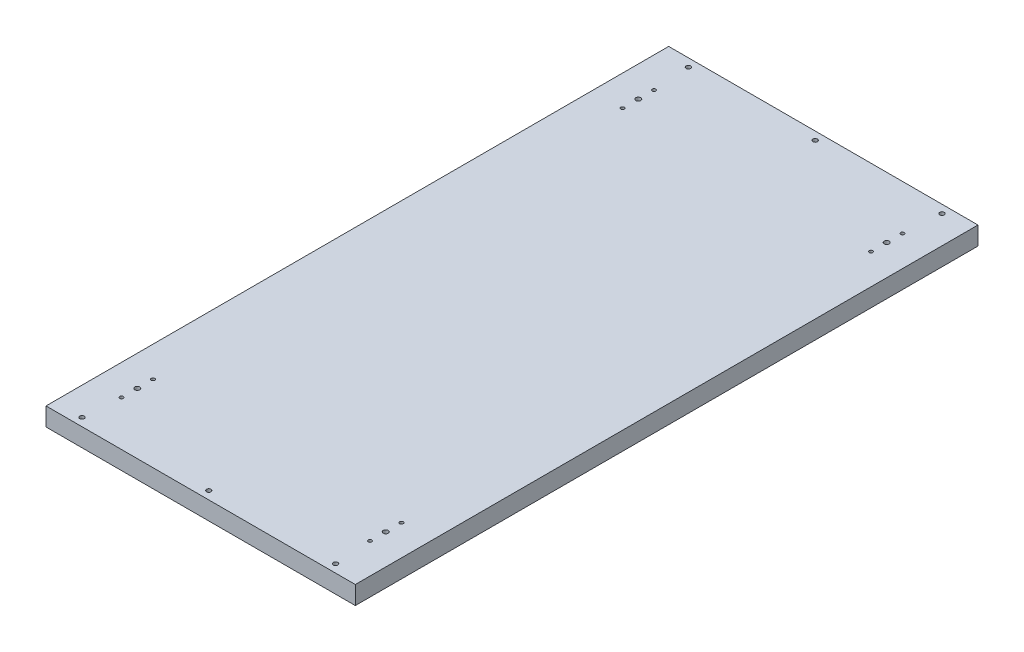
ISO-10303-21;
HEADER;
FILE_DESCRIPTION(('STEP AP214'),'2;1');
FILE_NAME('part.step','',(''),(''),'','','');
FILE_SCHEMA(('AUTOMOTIVE_DESIGN { 1 0 10303 214 1 1 1 1 }'));
ENDSEC;
DATA;
#1=APPLICATION_CONTEXT('core data for automotive mechanical design processes');
#2=APPLICATION_PROTOCOL_DEFINITION('international standard','automotive_design',2000,#1);
#3=PRODUCT_CONTEXT('',#1,'mechanical');
#4=PRODUCT('Part','Part','',(#3));
#5=PRODUCT_RELATED_PRODUCT_CATEGORY('part','',(#4));
#6=PRODUCT_DEFINITION_FORMATION('','',#4);
#7=PRODUCT_DEFINITION_CONTEXT('part definition',#1,'design');
#8=PRODUCT_DEFINITION('design','',#6,#7);
#9=PRODUCT_DEFINITION_SHAPE('','',#8);
#10=(LENGTH_UNIT() NAMED_UNIT(*) SI_UNIT(.MILLI.,.METRE.));
#11=(NAMED_UNIT(*) PLANE_ANGLE_UNIT() SI_UNIT($,.RADIAN.));
#12=(NAMED_UNIT(*) SI_UNIT($,.STERADIAN.) SOLID_ANGLE_UNIT());
#13=UNCERTAINTY_MEASURE_WITH_UNIT(LENGTH_MEASURE(1.E-05),#10,'distance_accuracy_value','');
#14=(GEOMETRIC_REPRESENTATION_CONTEXT(3) GLOBAL_UNCERTAINTY_ASSIGNED_CONTEXT((#13)) GLOBAL_UNIT_ASSIGNED_CONTEXT((#10,
#11,#12)) REPRESENTATION_CONTEXT('',''));
#15=CARTESIAN_POINT('',(0.,0.,0.));
#16=DIRECTION('',(0.,0.,1.));
#17=DIRECTION('',(1.,0.,0.));
#18=AXIS2_PLACEMENT_3D('',#15,#16,#17);
#19=CARTESIAN_POINT('',(-152.5,9.,-307.));
#20=DIRECTION('',(0.,0.,-1.));
#21=DIRECTION('',(-1.,0.,0.));
#22=AXIS2_PLACEMENT_3D('',#19,#20,#21);
#23=PLANE('',#22);
#24=DIRECTION('',(1.,0.,0.));
#25=VECTOR('',#24,1.);
#26=CARTESIAN_POINT('',(-152.5,-9.,-307.));
#27=LINE('',#26,#25);
#28=CARTESIAN_POINT('',(-152.5,-9.,-307.));
#29=VERTEX_POINT('',#28);
#30=CARTESIAN_POINT('',(152.5,-9.,-307.));
#31=VERTEX_POINT('',#30);
#32=EDGE_CURVE('E111',#29,#31,#27,.T.);
#33=ORIENTED_EDGE('',*,*,#32,.F.);
#34=DIRECTION('',(0.,-1.,0.));
#35=VECTOR('',#34,1.);
#36=CARTESIAN_POINT('',(-152.5,9.,-307.));
#37=LINE('',#36,#35);
#38=CARTESIAN_POINT('',(-152.5,9.,-307.));
#39=VERTEX_POINT('',#38);
#40=EDGE_CURVE('E11',#39,#29,#37,.T.);
#41=ORIENTED_EDGE('',*,*,#40,.F.);
#42=DIRECTION('',(1.,0.,0.));
#43=VECTOR('',#42,1.);
#44=CARTESIAN_POINT('',(-152.5,9.,-307.));
#45=LINE('',#44,#43);
#46=CARTESIAN_POINT('',(152.5,9.,-307.));
#47=VERTEX_POINT('',#46);
#48=EDGE_CURVE('E105',#39,#47,#45,.T.);
#49=ORIENTED_EDGE('',*,*,#48,.T.);
#50=DIRECTION('',(0.,-1.,0.));
#51=VECTOR('',#50,1.);
#52=CARTESIAN_POINT('',(152.5,9.,-307.));
#53=LINE('',#52,#51);
#54=EDGE_CURVE('E48',#47,#31,#53,.T.);
#55=ORIENTED_EDGE('',*,*,#54,.T.);
#56=EDGE_LOOP('',(#33,#41,#49,#55));
#57=FACE_BOUND('',#56,.T.);
#58=ADVANCED_FACE('F45',(#57),#23,.T.);
#59=CARTESIAN_POINT('',(-152.5,9.,-307.));
#60=DIRECTION('',(1.,0.,0.));
#61=DIRECTION('',(0.,0.,-1.));
#62=AXIS2_PLACEMENT_3D('',#59,#60,#61);
#63=PLANE('',#62);
#64=DIRECTION('',(0.,0.,1.));
#65=VECTOR('',#64,1.);
#66=CARTESIAN_POINT('',(-152.5,-9.,-307.));
#67=LINE('',#66,#65);
#68=CARTESIAN_POINT('',(-152.5,-9.,307.));
#69=VERTEX_POINT('',#68);
#70=EDGE_CURVE('E78',#29,#69,#67,.T.);
#71=ORIENTED_EDGE('',*,*,#70,.T.);
#72=DIRECTION('',(0.,-1.,0.));
#73=VECTOR('',#72,1.);
#74=CARTESIAN_POINT('',(-152.5,9.,307.));
#75=LINE('',#74,#73);
#76=CARTESIAN_POINT('',(-152.5,9.,307.));
#77=VERTEX_POINT('',#76);
#78=EDGE_CURVE('E54',#77,#69,#75,.T.);
#79=ORIENTED_EDGE('',*,*,#78,.F.);
#80=DIRECTION('',(0.,0.,1.));
#81=VECTOR('',#80,1.);
#82=CARTESIAN_POINT('',(-152.5,9.,-307.));
#83=LINE('',#82,#81);
#84=EDGE_CURVE('E95',#39,#77,#83,.T.);
#85=ORIENTED_EDGE('',*,*,#84,.F.);
#86=ORIENTED_EDGE('',*,*,#40,.T.);
#87=EDGE_LOOP('',(#71,#79,#85,#86));
#88=FACE_BOUND('',#87,.T.);
#89=ADVANCED_FACE('F122',(#88),#63,.F.);
#90=CARTESIAN_POINT('',(-152.5,9.,307.));
#91=DIRECTION('',(0.,0.,-1.));
#92=DIRECTION('',(-1.,0.,0.));
#93=AXIS2_PLACEMENT_3D('',#90,#91,#92);
#94=PLANE('',#93);
#95=DIRECTION('',(1.,0.,0.));
#96=VECTOR('',#95,1.);
#97=CARTESIAN_POINT('',(-152.5,-9.,307.));
#98=LINE('',#97,#96);
#99=CARTESIAN_POINT('',(152.5,-9.,307.));
#100=VERTEX_POINT('',#99);
#101=EDGE_CURVE('E102',#69,#100,#98,.T.);
#102=ORIENTED_EDGE('',*,*,#101,.T.);
#103=DIRECTION('',(0.,-1.,0.));
#104=VECTOR('',#103,1.);
#105=CARTESIAN_POINT('',(152.5,9.,307.));
#106=LINE('',#105,#104);
#107=CARTESIAN_POINT('',(152.5,9.,307.));
#108=VERTEX_POINT('',#107);
#109=EDGE_CURVE('E99',#108,#100,#106,.T.);
#110=ORIENTED_EDGE('',*,*,#109,.F.);
#111=DIRECTION('',(1.,0.,0.));
#112=VECTOR('',#111,1.);
#113=CARTESIAN_POINT('',(-152.5,9.,307.));
#114=LINE('',#113,#112);
#115=EDGE_CURVE('E90',#77,#108,#114,.T.);
#116=ORIENTED_EDGE('',*,*,#115,.F.);
#117=ORIENTED_EDGE('',*,*,#78,.T.);
#118=EDGE_LOOP('',(#102,#110,#116,#117));
#119=FACE_BOUND('',#118,.T.);
#120=ADVANCED_FACE('F100',(#119),#94,.F.);
#121=CARTESIAN_POINT('',(152.5,9.,-307.));
#122=DIRECTION('',(1.,0.,0.));
#123=DIRECTION('',(0.,0.,-1.));
#124=AXIS2_PLACEMENT_3D('',#121,#122,#123);
#125=PLANE('',#124);
#126=DIRECTION('',(0.,0.,1.));
#127=VECTOR('',#126,1.);
#128=CARTESIAN_POINT('',(152.5,-9.,-307.));
#129=LINE('',#128,#127);
#130=EDGE_CURVE('E114',#31,#100,#129,.T.);
#131=ORIENTED_EDGE('',*,*,#130,.F.);
#132=ORIENTED_EDGE('',*,*,#54,.F.);
#133=DIRECTION('',(0.,0.,1.));
#134=VECTOR('',#133,1.);
#135=CARTESIAN_POINT('',(152.5,9.,-307.));
#136=LINE('',#135,#134);
#137=EDGE_CURVE('E94',#47,#108,#136,.T.);
#138=ORIENTED_EDGE('',*,*,#137,.T.);
#139=ORIENTED_EDGE('',*,*,#109,.T.);
#140=EDGE_LOOP('',(#131,#132,#138,#139));
#141=FACE_BOUND('',#140,.T.);
#142=ADVANCED_FACE('F104',(#141),#125,.T.);
#143=CARTESIAN_POINT('',(0.,9.,0.));
#144=DIRECTION('',(0.,-1.,0.));
#145=DIRECTION('',(0.,0.,-1.));
#146=AXIS2_PLACEMENT_3D('',#143,#144,#145);
#147=PLANE('',#146);
#148=CARTESIAN_POINT('',(122.5,9.,-247.));
#149=DIRECTION('',(0.,-1.,0.));
#150=DIRECTION('',(0.,0.,-1.));
#151=AXIS2_PLACEMENT_3D('',#148,#149,#150);
#152=CIRCLE('',#151,2.45745);
#153=CARTESIAN_POINT('',(122.5,9.,-249.45745));
#154=VERTEX_POINT('',#153);
#155=EDGE_CURVE('E244',#154,#154,#152,.T.);
#156=ORIENTED_EDGE('',*,*,#155,.T.);
#157=EDGE_LOOP('',(#156));
#158=FACE_BOUND('',#157,.T.);
#159=CARTESIAN_POINT('',(-122.5,9.,-247.));
#160=DIRECTION('',(0.,-1.,0.));
#161=DIRECTION('',(0.,0.,-1.));
#162=AXIS2_PLACEMENT_3D('',#159,#160,#161);
#163=CIRCLE('',#162,2.45745);
#164=CARTESIAN_POINT('',(-122.5,9.,-249.45745));
#165=VERTEX_POINT('',#164);
#166=EDGE_CURVE('E254',#165,#165,#163,.T.);
#167=ORIENTED_EDGE('',*,*,#166,.T.);
#168=EDGE_LOOP('',(#167));
#169=FACE_BOUND('',#168,.T.);
#170=CARTESIAN_POINT('',(122.5,9.,247.));
#171=DIRECTION('',(0.,-1.,0.));
#172=DIRECTION('',(0.,0.,-1.));
#173=AXIS2_PLACEMENT_3D('',#170,#171,#172);
#174=CIRCLE('',#173,2.45745);
#175=CARTESIAN_POINT('',(122.5,9.,244.54255));
#176=VERTEX_POINT('',#175);
#177=EDGE_CURVE('E260',#176,#176,#174,.T.);
#178=ORIENTED_EDGE('',*,*,#177,.T.);
#179=EDGE_LOOP('',(#178));
#180=FACE_BOUND('',#179,.T.);
#181=CARTESIAN_POINT('',(122.5,9.,-262.5));
#182=DIRECTION('',(0.,-1.,0.));
#183=DIRECTION('',(0.,0.,-1.));
#184=AXIS2_PLACEMENT_3D('',#181,#182,#183);
#185=CIRCLE('',#184,1.7272);
#186=CARTESIAN_POINT('',(122.5,9.,-264.2272));
#187=VERTEX_POINT('',#186);
#188=EDGE_CURVE('E266',#187,#187,#185,.T.);
#189=ORIENTED_EDGE('',*,*,#188,.T.);
#190=EDGE_LOOP('',(#189));
#191=FACE_BOUND('',#190,.T.);
#192=CARTESIAN_POINT('',(122.5,9.,-231.5));
#193=DIRECTION('',(0.,-1.,0.));
#194=DIRECTION('',(0.,0.,-1.));
#195=AXIS2_PLACEMENT_3D('',#192,#193,#194);
#196=CIRCLE('',#195,1.7272);
#197=CARTESIAN_POINT('',(122.5,9.,-233.2272));
#198=VERTEX_POINT('',#197);
#199=EDGE_CURVE('E272',#198,#198,#196,.T.);
#200=ORIENTED_EDGE('',*,*,#199,.T.);
#201=EDGE_LOOP('',(#200));
#202=FACE_BOUND('',#201,.T.);
#203=CARTESIAN_POINT('',(-122.5,9.,-262.5));
#204=DIRECTION('',(0.,-1.,0.));
#205=DIRECTION('',(0.,0.,-1.));
#206=AXIS2_PLACEMENT_3D('',#203,#204,#205);
#207=CIRCLE('',#206,1.7272);
#208=CARTESIAN_POINT('',(-122.5,9.,-264.2272));
#209=VERTEX_POINT('',#208);
#210=EDGE_CURVE('E278',#209,#209,#207,.T.);
#211=ORIENTED_EDGE('',*,*,#210,.T.);
#212=EDGE_LOOP('',(#211));
#213=FACE_BOUND('',#212,.T.);
#214=CARTESIAN_POINT('',(-122.5,9.,-231.5));
#215=DIRECTION('',(0.,-1.,0.));
#216=DIRECTION('',(0.,0.,-1.));
#217=AXIS2_PLACEMENT_3D('',#214,#215,#216);
#218=CIRCLE('',#217,1.7272);
#219=CARTESIAN_POINT('',(-122.5,9.,-233.2272));
#220=VERTEX_POINT('',#219);
#221=EDGE_CURVE('E284',#220,#220,#218,.T.);
#222=ORIENTED_EDGE('',*,*,#221,.T.);
#223=EDGE_LOOP('',(#222));
#224=FACE_BOUND('',#223,.T.);
#225=CARTESIAN_POINT('',(122.5,9.,262.5));
#226=DIRECTION('',(0.,-1.,0.));
#227=DIRECTION('',(0.,0.,-1.));
#228=AXIS2_PLACEMENT_3D('',#225,#226,#227);
#229=CIRCLE('',#228,1.7272);
#230=CARTESIAN_POINT('',(122.5,9.,260.7728));
#231=VERTEX_POINT('',#230);
#232=EDGE_CURVE('E290',#231,#231,#229,.T.);
#233=ORIENTED_EDGE('',*,*,#232,.T.);
#234=EDGE_LOOP('',(#233));
#235=FACE_BOUND('',#234,.T.);
#236=CARTESIAN_POINT('',(122.5,9.,231.5));
#237=DIRECTION('',(0.,-1.,0.));
#238=DIRECTION('',(0.,0.,-1.));
#239=AXIS2_PLACEMENT_3D('',#236,#237,#238);
#240=CIRCLE('',#239,1.7272);
#241=CARTESIAN_POINT('',(122.5,9.,229.7728));
#242=VERTEX_POINT('',#241);
#243=EDGE_CURVE('E296',#242,#242,#240,.T.);
#244=ORIENTED_EDGE('',*,*,#243,.T.);
#245=EDGE_LOOP('',(#244));
#246=FACE_BOUND('',#245,.T.);
#247=CARTESIAN_POINT('',(-122.5,9.,247.));
#248=DIRECTION('',(0.,-1.,0.));
#249=DIRECTION('',(0.,0.,-1.));
#250=AXIS2_PLACEMENT_3D('',#247,#248,#249);
#251=CIRCLE('',#250,2.45745);
#252=CARTESIAN_POINT('',(-122.5,9.,244.54255));
#253=VERTEX_POINT('',#252);
#254=EDGE_CURVE('E302',#253,#253,#251,.T.);
#255=ORIENTED_EDGE('',*,*,#254,.T.);
#256=EDGE_LOOP('',(#255));
#257=FACE_BOUND('',#256,.T.);
#258=CARTESIAN_POINT('',(-122.5,9.,262.5));
#259=DIRECTION('',(0.,-1.,0.));
#260=DIRECTION('',(0.,0.,-1.));
#261=AXIS2_PLACEMENT_3D('',#258,#259,#260);
#262=CIRCLE('',#261,1.7272);
#263=CARTESIAN_POINT('',(-122.5,9.,260.7728));
#264=VERTEX_POINT('',#263);
#265=EDGE_CURVE('E308',#264,#264,#262,.T.);
#266=ORIENTED_EDGE('',*,*,#265,.T.);
#267=EDGE_LOOP('',(#266));
#268=FACE_BOUND('',#267,.T.);
#269=CARTESIAN_POINT('',(-122.5,9.,231.5));
#270=DIRECTION('',(0.,-1.,0.));
#271=DIRECTION('',(0.,0.,-1.));
#272=AXIS2_PLACEMENT_3D('',#269,#270,#271);
#273=CIRCLE('',#272,1.7272);
#274=CARTESIAN_POINT('',(-122.5,9.,229.7728));
#275=VERTEX_POINT('',#274);
#276=EDGE_CURVE('E314',#275,#275,#273,.T.);
#277=ORIENTED_EDGE('',*,*,#276,.T.);
#278=EDGE_LOOP('',(#277));
#279=FACE_BOUND('',#278,.T.);
#280=CARTESIAN_POINT('',(0.,9.,-299.));
#281=DIRECTION('',(0.,-1.,0.));
#282=DIRECTION('',(0.,0.,-1.));
#283=AXIS2_PLACEMENT_3D('',#280,#281,#282);
#284=CIRCLE('',#283,2.24789999999999);
#285=CARTESIAN_POINT('',(0.,9.,-301.2479));
#286=VERTEX_POINT('',#285);
#287=EDGE_CURVE('E323',#286,#286,#284,.T.);
#288=ORIENTED_EDGE('',*,*,#287,.T.);
#289=EDGE_LOOP('',(#288));
#290=FACE_BOUND('',#289,.T.);
#291=CARTESIAN_POINT('',(-125.,9.,-299.));
#292=DIRECTION('',(0.,-1.,0.));
#293=DIRECTION('',(0.,0.,-1.));
#294=AXIS2_PLACEMENT_3D('',#291,#292,#293);
#295=CIRCLE('',#294,2.2479);
#296=CARTESIAN_POINT('',(-125.,9.,-301.2479));
#297=VERTEX_POINT('',#296);
#298=EDGE_CURVE('E332',#297,#297,#295,.T.);
#299=ORIENTED_EDGE('',*,*,#298,.T.);
#300=EDGE_LOOP('',(#299));
#301=FACE_BOUND('',#300,.T.);
#302=CARTESIAN_POINT('',(125.,9.,-299.));
#303=DIRECTION('',(0.,-1.,0.));
#304=DIRECTION('',(0.,0.,-1.));
#305=AXIS2_PLACEMENT_3D('',#302,#303,#304);
#306=CIRCLE('',#305,2.24789999999998);
#307=CARTESIAN_POINT('',(125.,9.,-301.2479));
#308=VERTEX_POINT('',#307);
#309=EDGE_CURVE('E341',#308,#308,#306,.T.);
#310=ORIENTED_EDGE('',*,*,#309,.T.);
#311=EDGE_LOOP('',(#310));
#312=FACE_BOUND('',#311,.T.);
#313=CARTESIAN_POINT('',(0.,9.,299.));
#314=DIRECTION('',(0.,-1.,0.));
#315=DIRECTION('',(0.,0.,-1.));
#316=AXIS2_PLACEMENT_3D('',#313,#314,#315);
#317=CIRCLE('',#316,2.24789999999999);
#318=CARTESIAN_POINT('',(0.,9.,296.7521));
#319=VERTEX_POINT('',#318);
#320=EDGE_CURVE('E350',#319,#319,#317,.T.);
#321=ORIENTED_EDGE('',*,*,#320,.T.);
#322=EDGE_LOOP('',(#321));
#323=FACE_BOUND('',#322,.T.);
#324=CARTESIAN_POINT('',(-125.,9.,299.));
#325=DIRECTION('',(0.,-1.,0.));
#326=DIRECTION('',(0.,0.,-1.));
#327=AXIS2_PLACEMENT_3D('',#324,#325,#326);
#328=CIRCLE('',#327,2.2479);
#329=CARTESIAN_POINT('',(-125.,9.,296.7521));
#330=VERTEX_POINT('',#329);
#331=EDGE_CURVE('E359',#330,#330,#328,.T.);
#332=ORIENTED_EDGE('',*,*,#331,.T.);
#333=EDGE_LOOP('',(#332));
#334=FACE_BOUND('',#333,.T.);
#335=CARTESIAN_POINT('',(125.,9.,299.));
#336=DIRECTION('',(0.,-1.,0.));
#337=DIRECTION('',(0.,0.,-1.));
#338=AXIS2_PLACEMENT_3D('',#335,#336,#337);
#339=CIRCLE('',#338,2.24789999999998);
#340=CARTESIAN_POINT('',(125.,9.,296.7521));
#341=VERTEX_POINT('',#340);
#342=EDGE_CURVE('E115',#341,#341,#339,.T.);
#343=ORIENTED_EDGE('',*,*,#342,.T.);
#344=EDGE_LOOP('',(#343));
#345=FACE_BOUND('',#344,.T.);
#346=ORIENTED_EDGE('',*,*,#48,.F.);
#347=ORIENTED_EDGE('',*,*,#84,.T.);
#348=ORIENTED_EDGE('',*,*,#115,.T.);
#349=ORIENTED_EDGE('',*,*,#137,.F.);
#350=EDGE_LOOP('',(#346,#347,#348,#349));
#351=FACE_BOUND('',#350,.T.);
#352=ADVANCED_FACE('F93',(#158,#169,#180,#191,#202,#213,#224,#235,#246,#257,#268,#279,#290,#301,
#312,#323,#334,#345,#351),#147,.F.);
#353=CARTESIAN_POINT('',(0.,-9.,0.));
#354=DIRECTION('',(0.,-1.,0.));
#355=DIRECTION('',(0.,0.,-1.));
#356=AXIS2_PLACEMENT_3D('',#353,#354,#355);
#357=PLANE('',#356);
#358=CARTESIAN_POINT('',(122.5,-9.,-247.));
#359=DIRECTION('',(0.,-1.,0.));
#360=DIRECTION('',(0.,0.,-1.));
#361=AXIS2_PLACEMENT_3D('',#358,#359,#360);
#362=CIRCLE('',#361,2.45745);
#363=CARTESIAN_POINT('',(122.5,-9.,-249.45745));
#364=VERTEX_POINT('',#363);
#365=EDGE_CURVE('E247',#364,#364,#362,.T.);
#366=ORIENTED_EDGE('',*,*,#365,.F.);
#367=EDGE_LOOP('',(#366));
#368=FACE_BOUND('',#367,.T.);
#369=CARTESIAN_POINT('',(-122.5,-9.,-247.));
#370=DIRECTION('',(0.,-1.,0.));
#371=DIRECTION('',(0.,0.,-1.));
#372=AXIS2_PLACEMENT_3D('',#369,#370,#371);
#373=CIRCLE('',#372,2.45745);
#374=CARTESIAN_POINT('',(-122.5,-9.,-249.45745));
#375=VERTEX_POINT('',#374);
#376=EDGE_CURVE('E249',#375,#375,#373,.T.);
#377=ORIENTED_EDGE('',*,*,#376,.F.);
#378=EDGE_LOOP('',(#377));
#379=FACE_BOUND('',#378,.T.);
#380=CARTESIAN_POINT('',(122.5,-9.,247.));
#381=DIRECTION('',(0.,-1.,0.));
#382=DIRECTION('',(0.,0.,-1.));
#383=AXIS2_PLACEMENT_3D('',#380,#381,#382);
#384=CIRCLE('',#383,2.45745);
#385=CARTESIAN_POINT('',(122.5,-9.,244.54255));
#386=VERTEX_POINT('',#385);
#387=EDGE_CURVE('E257',#386,#386,#384,.T.);
#388=ORIENTED_EDGE('',*,*,#387,.F.);
#389=EDGE_LOOP('',(#388));
#390=FACE_BOUND('',#389,.T.);
#391=CARTESIAN_POINT('',(122.5,-9.,-262.5));
#392=DIRECTION('',(0.,-1.,0.));
#393=DIRECTION('',(0.,0.,-1.));
#394=AXIS2_PLACEMENT_3D('',#391,#392,#393);
#395=CIRCLE('',#394,1.7272);
#396=CARTESIAN_POINT('',(122.5,-9.,-264.2272));
#397=VERTEX_POINT('',#396);
#398=EDGE_CURVE('E263',#397,#397,#395,.T.);
#399=ORIENTED_EDGE('',*,*,#398,.F.);
#400=EDGE_LOOP('',(#399));
#401=FACE_BOUND('',#400,.T.);
#402=CARTESIAN_POINT('',(122.5,-9.,-231.5));
#403=DIRECTION('',(0.,-1.,0.));
#404=DIRECTION('',(0.,0.,-1.));
#405=AXIS2_PLACEMENT_3D('',#402,#403,#404);
#406=CIRCLE('',#405,1.7272);
#407=CARTESIAN_POINT('',(122.5,-9.,-233.2272));
#408=VERTEX_POINT('',#407);
#409=EDGE_CURVE('E269',#408,#408,#406,.T.);
#410=ORIENTED_EDGE('',*,*,#409,.F.);
#411=EDGE_LOOP('',(#410));
#412=FACE_BOUND('',#411,.T.);
#413=CARTESIAN_POINT('',(-122.5,-9.,-262.5));
#414=DIRECTION('',(0.,-1.,0.));
#415=DIRECTION('',(0.,0.,-1.));
#416=AXIS2_PLACEMENT_3D('',#413,#414,#415);
#417=CIRCLE('',#416,1.7272);
#418=CARTESIAN_POINT('',(-122.5,-9.,-264.2272));
#419=VERTEX_POINT('',#418);
#420=EDGE_CURVE('E275',#419,#419,#417,.T.);
#421=ORIENTED_EDGE('',*,*,#420,.F.);
#422=EDGE_LOOP('',(#421));
#423=FACE_BOUND('',#422,.T.);
#424=CARTESIAN_POINT('',(-122.5,-9.,-231.5));
#425=DIRECTION('',(0.,-1.,0.));
#426=DIRECTION('',(0.,0.,-1.));
#427=AXIS2_PLACEMENT_3D('',#424,#425,#426);
#428=CIRCLE('',#427,1.7272);
#429=CARTESIAN_POINT('',(-122.5,-9.,-233.2272));
#430=VERTEX_POINT('',#429);
#431=EDGE_CURVE('E281',#430,#430,#428,.T.);
#432=ORIENTED_EDGE('',*,*,#431,.F.);
#433=EDGE_LOOP('',(#432));
#434=FACE_BOUND('',#433,.T.);
#435=CARTESIAN_POINT('',(122.5,-9.,262.5));
#436=DIRECTION('',(0.,-1.,0.));
#437=DIRECTION('',(0.,0.,-1.));
#438=AXIS2_PLACEMENT_3D('',#435,#436,#437);
#439=CIRCLE('',#438,1.7272);
#440=CARTESIAN_POINT('',(122.5,-9.,260.7728));
#441=VERTEX_POINT('',#440);
#442=EDGE_CURVE('E287',#441,#441,#439,.T.);
#443=ORIENTED_EDGE('',*,*,#442,.F.);
#444=EDGE_LOOP('',(#443));
#445=FACE_BOUND('',#444,.T.);
#446=CARTESIAN_POINT('',(122.5,-9.,231.5));
#447=DIRECTION('',(0.,-1.,0.));
#448=DIRECTION('',(0.,0.,-1.));
#449=AXIS2_PLACEMENT_3D('',#446,#447,#448);
#450=CIRCLE('',#449,1.7272);
#451=CARTESIAN_POINT('',(122.5,-9.,229.7728));
#452=VERTEX_POINT('',#451);
#453=EDGE_CURVE('E293',#452,#452,#450,.T.);
#454=ORIENTED_EDGE('',*,*,#453,.F.);
#455=EDGE_LOOP('',(#454));
#456=FACE_BOUND('',#455,.T.);
#457=CARTESIAN_POINT('',(-122.5,-9.,247.));
#458=DIRECTION('',(0.,-1.,0.));
#459=DIRECTION('',(0.,0.,-1.));
#460=AXIS2_PLACEMENT_3D('',#457,#458,#459);
#461=CIRCLE('',#460,2.45745);
#462=CARTESIAN_POINT('',(-122.5,-9.,244.54255));
#463=VERTEX_POINT('',#462);
#464=EDGE_CURVE('E299',#463,#463,#461,.T.);
#465=ORIENTED_EDGE('',*,*,#464,.F.);
#466=EDGE_LOOP('',(#465));
#467=FACE_BOUND('',#466,.T.);
#468=CARTESIAN_POINT('',(-122.5,-9.,262.5));
#469=DIRECTION('',(0.,-1.,0.));
#470=DIRECTION('',(0.,0.,-1.));
#471=AXIS2_PLACEMENT_3D('',#468,#469,#470);
#472=CIRCLE('',#471,1.7272);
#473=CARTESIAN_POINT('',(-122.5,-9.,260.7728));
#474=VERTEX_POINT('',#473);
#475=EDGE_CURVE('E305',#474,#474,#472,.T.);
#476=ORIENTED_EDGE('',*,*,#475,.F.);
#477=EDGE_LOOP('',(#476));
#478=FACE_BOUND('',#477,.T.);
#479=CARTESIAN_POINT('',(-122.5,-9.,231.5));
#480=DIRECTION('',(0.,-1.,0.));
#481=DIRECTION('',(0.,0.,-1.));
#482=AXIS2_PLACEMENT_3D('',#479,#480,#481);
#483=CIRCLE('',#482,1.7272);
#484=CARTESIAN_POINT('',(-122.5,-9.,229.7728));
#485=VERTEX_POINT('',#484);
#486=EDGE_CURVE('E311',#485,#485,#483,.T.);
#487=ORIENTED_EDGE('',*,*,#486,.F.);
#488=EDGE_LOOP('',(#487));
#489=FACE_BOUND('',#488,.T.);
#490=CARTESIAN_POINT('',(0.,-9.,-299.));
#491=DIRECTION('',(0.,-1.,0.));
#492=DIRECTION('',(0.,0.,-1.));
#493=AXIS2_PLACEMENT_3D('',#490,#491,#492);
#494=CIRCLE('',#493,4.2164);
#495=CARTESIAN_POINT('',(0.,-9.,-303.2164));
#496=VERTEX_POINT('',#495);
#497=EDGE_CURVE('E317',#496,#496,#494,.T.);
#498=ORIENTED_EDGE('',*,*,#497,.F.);
#499=EDGE_LOOP('',(#498));
#500=FACE_BOUND('',#499,.T.);
#501=CARTESIAN_POINT('',(-125.,-9.,-299.));
#502=DIRECTION('',(0.,-1.,0.));
#503=DIRECTION('',(0.,0.,-1.));
#504=AXIS2_PLACEMENT_3D('',#501,#502,#503);
#505=CIRCLE('',#504,4.21639999999999);
#506=CARTESIAN_POINT('',(-125.,-9.,-303.2164));
#507=VERTEX_POINT('',#506);
#508=EDGE_CURVE('E326',#507,#507,#505,.T.);
#509=ORIENTED_EDGE('',*,*,#508,.F.);
#510=EDGE_LOOP('',(#509));
#511=FACE_BOUND('',#510,.T.);
#512=CARTESIAN_POINT('',(125.,-9.,-299.));
#513=DIRECTION('',(0.,-1.,0.));
#514=DIRECTION('',(0.,0.,-1.));
#515=AXIS2_PLACEMENT_3D('',#512,#513,#514);
#516=CIRCLE('',#515,4.21639999999999);
#517=CARTESIAN_POINT('',(125.,-9.,-303.2164));
#518=VERTEX_POINT('',#517);
#519=EDGE_CURVE('E335',#518,#518,#516,.T.);
#520=ORIENTED_EDGE('',*,*,#519,.F.);
#521=EDGE_LOOP('',(#520));
#522=FACE_BOUND('',#521,.T.);
#523=CARTESIAN_POINT('',(0.,-9.,299.));
#524=DIRECTION('',(0.,-1.,0.));
#525=DIRECTION('',(0.,0.,-1.));
#526=AXIS2_PLACEMENT_3D('',#523,#524,#525);
#527=CIRCLE('',#526,4.2164);
#528=CARTESIAN_POINT('',(0.,-9.,294.7836));
#529=VERTEX_POINT('',#528);
#530=EDGE_CURVE('E344',#529,#529,#527,.T.);
#531=ORIENTED_EDGE('',*,*,#530,.F.);
#532=EDGE_LOOP('',(#531));
#533=FACE_BOUND('',#532,.T.);
#534=CARTESIAN_POINT('',(-125.,-9.,299.));
#535=DIRECTION('',(0.,-1.,0.));
#536=DIRECTION('',(0.,0.,-1.));
#537=AXIS2_PLACEMENT_3D('',#534,#535,#536);
#538=CIRCLE('',#537,4.21639999999999);
#539=CARTESIAN_POINT('',(-125.,-9.,294.7836));
#540=VERTEX_POINT('',#539);
#541=EDGE_CURVE('E353',#540,#540,#538,.T.);
#542=ORIENTED_EDGE('',*,*,#541,.F.);
#543=EDGE_LOOP('',(#542));
#544=FACE_BOUND('',#543,.T.);
#545=CARTESIAN_POINT('',(125.,-9.,299.));
#546=DIRECTION('',(0.,-1.,0.));
#547=DIRECTION('',(0.,0.,-1.));
#548=AXIS2_PLACEMENT_3D('',#545,#546,#547);
#549=CIRCLE('',#548,4.21639999999999);
#550=CARTESIAN_POINT('',(125.,-9.,294.7836));
#551=VERTEX_POINT('',#550);
#552=EDGE_CURVE('E362',#551,#551,#549,.T.);
#553=ORIENTED_EDGE('',*,*,#552,.F.);
#554=EDGE_LOOP('',(#553));
#555=FACE_BOUND('',#554,.T.);
#556=ORIENTED_EDGE('',*,*,#32,.T.);
#557=ORIENTED_EDGE('',*,*,#130,.T.);
#558=ORIENTED_EDGE('',*,*,#101,.F.);
#559=ORIENTED_EDGE('',*,*,#70,.F.);
#560=EDGE_LOOP('',(#556,#557,#558,#559));
#561=FACE_BOUND('',#560,.T.);
#562=ADVANCED_FACE('F120',(#368,#379,#390,#401,#412,#423,#434,#445,#456,#467,#478,#489,#500,
#511,#522,#533,#544,#555,#561),#357,.T.);
#563=CARTESIAN_POINT('',(125.,-9.,299.));
#564=DIRECTION('',(0.,-1.,0.));
#565=DIRECTION('',(0.,0.,-1.));
#566=AXIS2_PLACEMENT_3D('',#563,#564,#565);
#567=CYLINDRICAL_SURFACE('',#566,2.24789999999998);
#568=ORIENTED_EDGE('',*,*,#342,.F.);
#569=EDGE_LOOP('',(#568));
#570=FACE_BOUND('',#569,.T.);
#571=CARTESIAN_POINT('',(125.,-7.34823237602753,299.));
#572=DIRECTION('',(0.,-1.,0.));
#573=DIRECTION('',(0.,0.,-1.));
#574=AXIS2_PLACEMENT_3D('',#571,#572,#573);
#575=CIRCLE('',#574,2.24789999999998);
#576=CARTESIAN_POINT('',(125.,-7.34823237602753,296.7521));
#577=VERTEX_POINT('',#576);
#578=EDGE_CURVE('E365',#577,#577,#575,.T.);
#579=ORIENTED_EDGE('',*,*,#578,.T.);
#580=EDGE_LOOP('',(#579));
#581=FACE_BOUND('',#580,.T.);
#582=ADVANCED_FACE('F143',(#570,#581),#567,.F.);
#583=CARTESIAN_POINT('',(125.,-9.,299.));
#584=DIRECTION('',(0.,-1.,0.));
#585=DIRECTION('',(0.,0.,-1.));
#586=AXIS2_PLACEMENT_3D('',#583,#584,#585);
#587=CONICAL_SURFACE('',#586,4.21639999999999,0.872664625997169);
#588=ORIENTED_EDGE('',*,*,#578,.F.);
#589=EDGE_LOOP('',(#588));
#590=FACE_BOUND('',#589,.T.);
#591=ORIENTED_EDGE('',*,*,#552,.T.);
#592=EDGE_LOOP('',(#591));
#593=FACE_BOUND('',#592,.T.);
#594=ADVANCED_FACE('F149',(#590,#593),#587,.F.);
#595=CARTESIAN_POINT('',(-125.,-9.,299.));
#596=DIRECTION('',(0.,-1.,0.));
#597=DIRECTION('',(0.,0.,-1.));
#598=AXIS2_PLACEMENT_3D('',#595,#596,#597);
#599=CYLINDRICAL_SURFACE('',#598,2.24789999999999);
#600=ORIENTED_EDGE('',*,*,#331,.F.);
#601=EDGE_LOOP('',(#600));
#602=FACE_BOUND('',#601,.T.);
#603=CARTESIAN_POINT('',(-125.,-7.34823237602753,299.));
#604=DIRECTION('',(0.,-1.,0.));
#605=DIRECTION('',(0.,0.,-1.));
#606=AXIS2_PLACEMENT_3D('',#603,#604,#605);
#607=CIRCLE('',#606,2.24789999999998);
#608=CARTESIAN_POINT('',(-125.,-7.34823237602753,296.7521));
#609=VERTEX_POINT('',#608);
#610=EDGE_CURVE('E356',#609,#609,#607,.T.);
#611=ORIENTED_EDGE('',*,*,#610,.T.);
#612=EDGE_LOOP('',(#611));
#613=FACE_BOUND('',#612,.T.);
#614=ADVANCED_FACE('F153',(#602,#613),#599,.F.);
#615=CARTESIAN_POINT('',(-125.,-9.,299.));
#616=DIRECTION('',(0.,-1.,0.));
#617=DIRECTION('',(0.,0.,-1.));
#618=AXIS2_PLACEMENT_3D('',#615,#616,#617);
#619=CONICAL_SURFACE('',#618,4.21639999999999,0.872664625997169);
#620=ORIENTED_EDGE('',*,*,#610,.F.);
#621=EDGE_LOOP('',(#620));
#622=FACE_BOUND('',#621,.T.);
#623=ORIENTED_EDGE('',*,*,#541,.T.);
#624=EDGE_LOOP('',(#623));
#625=FACE_BOUND('',#624,.T.);
#626=ADVANCED_FACE('F157',(#622,#625),#619,.F.);
#627=CARTESIAN_POINT('',(0.,-9.,299.));
#628=DIRECTION('',(0.,-1.,0.));
#629=DIRECTION('',(0.,0.,-1.));
#630=AXIS2_PLACEMENT_3D('',#627,#628,#629);
#631=CYLINDRICAL_SURFACE('',#630,2.24789999999999);
#632=ORIENTED_EDGE('',*,*,#320,.F.);
#633=EDGE_LOOP('',(#632));
#634=FACE_BOUND('',#633,.T.);
#635=CARTESIAN_POINT('',(0.,-7.34823237602753,299.));
#636=DIRECTION('',(0.,-1.,0.));
#637=DIRECTION('',(0.,0.,-1.));
#638=AXIS2_PLACEMENT_3D('',#635,#636,#637);
#639=CIRCLE('',#638,2.24789999999999);
#640=CARTESIAN_POINT('',(0.,-7.34823237602753,296.7521));
#641=VERTEX_POINT('',#640);
#642=EDGE_CURVE('E347',#641,#641,#639,.T.);
#643=ORIENTED_EDGE('',*,*,#642,.T.);
#644=EDGE_LOOP('',(#643));
#645=FACE_BOUND('',#644,.T.);
#646=ADVANCED_FACE('F161',(#634,#645),#631,.F.);
#647=CARTESIAN_POINT('',(0.,-9.,299.));
#648=DIRECTION('',(0.,-1.,0.));
#649=DIRECTION('',(0.,0.,-1.));
#650=AXIS2_PLACEMENT_3D('',#647,#648,#649);
#651=CONICAL_SURFACE('',#650,4.2164,0.87266462599717);
#652=ORIENTED_EDGE('',*,*,#642,.F.);
#653=EDGE_LOOP('',(#652));
#654=FACE_BOUND('',#653,.T.);
#655=ORIENTED_EDGE('',*,*,#530,.T.);
#656=EDGE_LOOP('',(#655));
#657=FACE_BOUND('',#656,.T.);
#658=ADVANCED_FACE('F165',(#654,#657),#651,.F.);
#659=CARTESIAN_POINT('',(125.,-9.,-299.));
#660=DIRECTION('',(0.,-1.,0.));
#661=DIRECTION('',(0.,0.,-1.));
#662=AXIS2_PLACEMENT_3D('',#659,#660,#661);
#663=CYLINDRICAL_SURFACE('',#662,2.24789999999998);
#664=ORIENTED_EDGE('',*,*,#309,.F.);
#665=EDGE_LOOP('',(#664));
#666=FACE_BOUND('',#665,.T.);
#667=CARTESIAN_POINT('',(125.,-7.34823237602753,-299.));
#668=DIRECTION('',(0.,-1.,0.));
#669=DIRECTION('',(0.,0.,-1.));
#670=AXIS2_PLACEMENT_3D('',#667,#668,#669);
#671=CIRCLE('',#670,2.24789999999998);
#672=CARTESIAN_POINT('',(125.,-7.34823237602753,-301.2479));
#673=VERTEX_POINT('',#672);
#674=EDGE_CURVE('E338',#673,#673,#671,.T.);
#675=ORIENTED_EDGE('',*,*,#674,.T.);
#676=EDGE_LOOP('',(#675));
#677=FACE_BOUND('',#676,.T.);
#678=ADVANCED_FACE('F169',(#666,#677),#663,.F.);
#679=CARTESIAN_POINT('',(125.,-9.,-299.));
#680=DIRECTION('',(0.,-1.,0.));
#681=DIRECTION('',(0.,0.,-1.));
#682=AXIS2_PLACEMENT_3D('',#679,#680,#681);
#683=CONICAL_SURFACE('',#682,4.21639999999999,0.872664625997169);
#684=ORIENTED_EDGE('',*,*,#674,.F.);
#685=EDGE_LOOP('',(#684));
#686=FACE_BOUND('',#685,.T.);
#687=ORIENTED_EDGE('',*,*,#519,.T.);
#688=EDGE_LOOP('',(#687));
#689=FACE_BOUND('',#688,.T.);
#690=ADVANCED_FACE('F173',(#686,#689),#683,.F.);
#691=CARTESIAN_POINT('',(-125.,-9.,-299.));
#692=DIRECTION('',(0.,-1.,0.));
#693=DIRECTION('',(0.,0.,-1.));
#694=AXIS2_PLACEMENT_3D('',#691,#692,#693);
#695=CYLINDRICAL_SURFACE('',#694,2.24789999999999);
#696=ORIENTED_EDGE('',*,*,#298,.F.);
#697=EDGE_LOOP('',(#696));
#698=FACE_BOUND('',#697,.T.);
#699=CARTESIAN_POINT('',(-125.,-7.34823237602753,-299.));
#700=DIRECTION('',(0.,-1.,0.));
#701=DIRECTION('',(0.,0.,-1.));
#702=AXIS2_PLACEMENT_3D('',#699,#700,#701);
#703=CIRCLE('',#702,2.24789999999998);
#704=CARTESIAN_POINT('',(-125.,-7.34823237602753,-301.2479));
#705=VERTEX_POINT('',#704);
#706=EDGE_CURVE('E329',#705,#705,#703,.T.);
#707=ORIENTED_EDGE('',*,*,#706,.T.);
#708=EDGE_LOOP('',(#707));
#709=FACE_BOUND('',#708,.T.);
#710=ADVANCED_FACE('F177',(#698,#709),#695,.F.);
#711=CARTESIAN_POINT('',(-125.,-9.,-299.));
#712=DIRECTION('',(0.,-1.,0.));
#713=DIRECTION('',(0.,0.,-1.));
#714=AXIS2_PLACEMENT_3D('',#711,#712,#713);
#715=CONICAL_SURFACE('',#714,4.21639999999999,0.872664625997169);
#716=ORIENTED_EDGE('',*,*,#706,.F.);
#717=EDGE_LOOP('',(#716));
#718=FACE_BOUND('',#717,.T.);
#719=ORIENTED_EDGE('',*,*,#508,.T.);
#720=EDGE_LOOP('',(#719));
#721=FACE_BOUND('',#720,.T.);
#722=ADVANCED_FACE('F181',(#718,#721),#715,.F.);
#723=CARTESIAN_POINT('',(0.,-9.,-299.));
#724=DIRECTION('',(0.,-1.,0.));
#725=DIRECTION('',(0.,0.,-1.));
#726=AXIS2_PLACEMENT_3D('',#723,#724,#725);
#727=CYLINDRICAL_SURFACE('',#726,2.24789999999999);
#728=ORIENTED_EDGE('',*,*,#287,.F.);
#729=EDGE_LOOP('',(#728));
#730=FACE_BOUND('',#729,.T.);
#731=CARTESIAN_POINT('',(0.,-7.34823237602753,-299.));
#732=DIRECTION('',(0.,-1.,0.));
#733=DIRECTION('',(0.,0.,-1.));
#734=AXIS2_PLACEMENT_3D('',#731,#732,#733);
#735=CIRCLE('',#734,2.24789999999999);
#736=CARTESIAN_POINT('',(0.,-7.34823237602753,-301.2479));
#737=VERTEX_POINT('',#736);
#738=EDGE_CURVE('E320',#737,#737,#735,.T.);
#739=ORIENTED_EDGE('',*,*,#738,.T.);
#740=EDGE_LOOP('',(#739));
#741=FACE_BOUND('',#740,.T.);
#742=ADVANCED_FACE('F185',(#730,#741),#727,.F.);
#743=CARTESIAN_POINT('',(0.,-9.,-299.));
#744=DIRECTION('',(0.,-1.,0.));
#745=DIRECTION('',(0.,0.,-1.));
#746=AXIS2_PLACEMENT_3D('',#743,#744,#745);
#747=CONICAL_SURFACE('',#746,4.2164,0.87266462599717);
#748=ORIENTED_EDGE('',*,*,#738,.F.);
#749=EDGE_LOOP('',(#748));
#750=FACE_BOUND('',#749,.T.);
#751=ORIENTED_EDGE('',*,*,#497,.T.);
#752=EDGE_LOOP('',(#751));
#753=FACE_BOUND('',#752,.T.);
#754=ADVANCED_FACE('F189',(#750,#753),#747,.F.);
#755=CARTESIAN_POINT('',(-122.5,-9.,231.5));
#756=DIRECTION('',(0.,-1.,0.));
#757=DIRECTION('',(0.,0.,-1.));
#758=AXIS2_PLACEMENT_3D('',#755,#756,#757);
#759=CYLINDRICAL_SURFACE('',#758,1.7272);
#760=ORIENTED_EDGE('',*,*,#276,.F.);
#761=EDGE_LOOP('',(#760));
#762=FACE_BOUND('',#761,.T.);
#763=ORIENTED_EDGE('',*,*,#486,.T.);
#764=EDGE_LOOP('',(#763));
#765=FACE_BOUND('',#764,.T.);
#766=ADVANCED_FACE('F193',(#762,#765),#759,.F.);
#767=CARTESIAN_POINT('',(-122.5,-9.,262.5));
#768=DIRECTION('',(0.,-1.,0.));
#769=DIRECTION('',(0.,0.,-1.));
#770=AXIS2_PLACEMENT_3D('',#767,#768,#769);
#771=CYLINDRICAL_SURFACE('',#770,1.7272);
#772=ORIENTED_EDGE('',*,*,#265,.F.);
#773=EDGE_LOOP('',(#772));
#774=FACE_BOUND('',#773,.T.);
#775=ORIENTED_EDGE('',*,*,#475,.T.);
#776=EDGE_LOOP('',(#775));
#777=FACE_BOUND('',#776,.T.);
#778=ADVANCED_FACE('F197',(#774,#777),#771,.F.);
#779=CARTESIAN_POINT('',(-122.5,-9.,247.));
#780=DIRECTION('',(0.,-1.,0.));
#781=DIRECTION('',(0.,0.,-1.));
#782=AXIS2_PLACEMENT_3D('',#779,#780,#781);
#783=CYLINDRICAL_SURFACE('',#782,2.45745);
#784=ORIENTED_EDGE('',*,*,#254,.F.);
#785=EDGE_LOOP('',(#784));
#786=FACE_BOUND('',#785,.T.);
#787=ORIENTED_EDGE('',*,*,#464,.T.);
#788=EDGE_LOOP('',(#787));
#789=FACE_BOUND('',#788,.T.);
#790=ADVANCED_FACE('F201',(#786,#789),#783,.F.);
#791=CARTESIAN_POINT('',(122.5,-9.,231.5));
#792=DIRECTION('',(0.,-1.,0.));
#793=DIRECTION('',(0.,0.,-1.));
#794=AXIS2_PLACEMENT_3D('',#791,#792,#793);
#795=CYLINDRICAL_SURFACE('',#794,1.7272);
#796=ORIENTED_EDGE('',*,*,#243,.F.);
#797=EDGE_LOOP('',(#796));
#798=FACE_BOUND('',#797,.T.);
#799=ORIENTED_EDGE('',*,*,#453,.T.);
#800=EDGE_LOOP('',(#799));
#801=FACE_BOUND('',#800,.T.);
#802=ADVANCED_FACE('F204',(#798,#801),#795,.F.);
#803=CARTESIAN_POINT('',(122.5,-9.,262.5));
#804=DIRECTION('',(0.,-1.,0.));
#805=DIRECTION('',(0.,0.,-1.));
#806=AXIS2_PLACEMENT_3D('',#803,#804,#805);
#807=CYLINDRICAL_SURFACE('',#806,1.7272);
#808=ORIENTED_EDGE('',*,*,#232,.F.);
#809=EDGE_LOOP('',(#808));
#810=FACE_BOUND('',#809,.T.);
#811=ORIENTED_EDGE('',*,*,#442,.T.);
#812=EDGE_LOOP('',(#811));
#813=FACE_BOUND('',#812,.T.);
#814=ADVANCED_FACE('F208',(#810,#813),#807,.F.);
#815=CARTESIAN_POINT('',(-122.5,-9.,-231.5));
#816=DIRECTION('',(0.,-1.,0.));
#817=DIRECTION('',(0.,0.,-1.));
#818=AXIS2_PLACEMENT_3D('',#815,#816,#817);
#819=CYLINDRICAL_SURFACE('',#818,1.7272);
#820=ORIENTED_EDGE('',*,*,#221,.F.);
#821=EDGE_LOOP('',(#820));
#822=FACE_BOUND('',#821,.T.);
#823=ORIENTED_EDGE('',*,*,#431,.T.);
#824=EDGE_LOOP('',(#823));
#825=FACE_BOUND('',#824,.T.);
#826=ADVANCED_FACE('F212',(#822,#825),#819,.F.);
#827=CARTESIAN_POINT('',(-122.5,-9.,-262.5));
#828=DIRECTION('',(0.,-1.,0.));
#829=DIRECTION('',(0.,0.,-1.));
#830=AXIS2_PLACEMENT_3D('',#827,#828,#829);
#831=CYLINDRICAL_SURFACE('',#830,1.7272);
#832=ORIENTED_EDGE('',*,*,#210,.F.);
#833=EDGE_LOOP('',(#832));
#834=FACE_BOUND('',#833,.T.);
#835=ORIENTED_EDGE('',*,*,#420,.T.);
#836=EDGE_LOOP('',(#835));
#837=FACE_BOUND('',#836,.T.);
#838=ADVANCED_FACE('F216',(#834,#837),#831,.F.);
#839=CARTESIAN_POINT('',(122.5,-9.,-231.5));
#840=DIRECTION('',(0.,-1.,0.));
#841=DIRECTION('',(0.,0.,-1.));
#842=AXIS2_PLACEMENT_3D('',#839,#840,#841);
#843=CYLINDRICAL_SURFACE('',#842,1.7272);
#844=ORIENTED_EDGE('',*,*,#199,.F.);
#845=EDGE_LOOP('',(#844));
#846=FACE_BOUND('',#845,.T.);
#847=ORIENTED_EDGE('',*,*,#409,.T.);
#848=EDGE_LOOP('',(#847));
#849=FACE_BOUND('',#848,.T.);
#850=ADVANCED_FACE('F220',(#846,#849),#843,.F.);
#851=CARTESIAN_POINT('',(122.5,-9.,-262.5));
#852=DIRECTION('',(0.,-1.,0.));
#853=DIRECTION('',(0.,0.,-1.));
#854=AXIS2_PLACEMENT_3D('',#851,#852,#853);
#855=CYLINDRICAL_SURFACE('',#854,1.7272);
#856=ORIENTED_EDGE('',*,*,#188,.F.);
#857=EDGE_LOOP('',(#856));
#858=FACE_BOUND('',#857,.T.);
#859=ORIENTED_EDGE('',*,*,#398,.T.);
#860=EDGE_LOOP('',(#859));
#861=FACE_BOUND('',#860,.T.);
#862=ADVANCED_FACE('F224',(#858,#861),#855,.F.);
#863=CARTESIAN_POINT('',(122.5,-9.,247.));
#864=DIRECTION('',(0.,-1.,0.));
#865=DIRECTION('',(0.,0.,-1.));
#866=AXIS2_PLACEMENT_3D('',#863,#864,#865);
#867=CYLINDRICAL_SURFACE('',#866,2.45745);
#868=ORIENTED_EDGE('',*,*,#177,.F.);
#869=EDGE_LOOP('',(#868));
#870=FACE_BOUND('',#869,.T.);
#871=ORIENTED_EDGE('',*,*,#387,.T.);
#872=EDGE_LOOP('',(#871));
#873=FACE_BOUND('',#872,.T.);
#874=ADVANCED_FACE('F228',(#870,#873),#867,.F.);
#875=CARTESIAN_POINT('',(-122.5,-9.,-247.));
#876=DIRECTION('',(0.,-1.,0.));
#877=DIRECTION('',(0.,0.,-1.));
#878=AXIS2_PLACEMENT_3D('',#875,#876,#877);
#879=CYLINDRICAL_SURFACE('',#878,2.45745);
#880=ORIENTED_EDGE('',*,*,#166,.F.);
#881=EDGE_LOOP('',(#880));
#882=FACE_BOUND('',#881,.T.);
#883=ORIENTED_EDGE('',*,*,#376,.T.);
#884=EDGE_LOOP('',(#883));
#885=FACE_BOUND('',#884,.T.);
#886=ADVANCED_FACE('F232',(#882,#885),#879,.F.);
#887=CARTESIAN_POINT('',(122.5,-9.,-247.));
#888=DIRECTION('',(0.,-1.,0.));
#889=DIRECTION('',(0.,0.,-1.));
#890=AXIS2_PLACEMENT_3D('',#887,#888,#889);
#891=CYLINDRICAL_SURFACE('',#890,2.45745);
#892=ORIENTED_EDGE('',*,*,#155,.F.);
#893=EDGE_LOOP('',(#892));
#894=FACE_BOUND('',#893,.T.);
#895=ORIENTED_EDGE('',*,*,#365,.T.);
#896=EDGE_LOOP('',(#895));
#897=FACE_BOUND('',#896,.T.);
#898=ADVANCED_FACE('F236',(#894,#897),#891,.F.);
#899=CLOSED_SHELL('',(#58,#89,#120,#142,#352,#562,#582,#594,#614,#626,#646,#658,#678,#690,#710,
#722,#742,#754,#766,#778,#790,#802,#814,#826,#838,#850,#862,#874,#886,#898));
#900=MANIFOLD_SOLID_BREP('B2',#899);
#901=ADVANCED_BREP_SHAPE_REPRESENTATION('',(#18,#900),#14);
#902=SHAPE_DEFINITION_REPRESENTATION(#9,#901);
ENDSEC;
END-ISO-10303-21;
